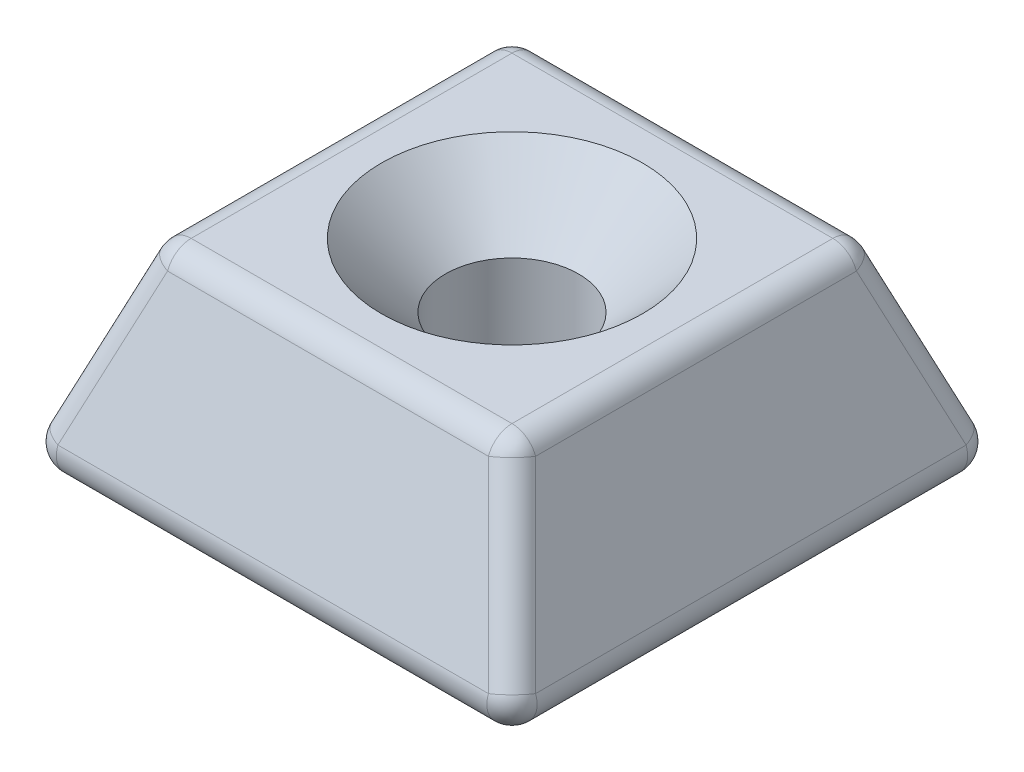
ISO-10303-21;
HEADER;
FILE_DESCRIPTION(('STEP AP214'),'2;1');
FILE_NAME('part.step','',(''),(''),'','','');
FILE_SCHEMA(('AUTOMOTIVE_DESIGN { 1 0 10303 214 1 1 1 1 }'));
ENDSEC;
DATA;
#1=APPLICATION_CONTEXT('core data for automotive mechanical design processes');
#2=APPLICATION_PROTOCOL_DEFINITION('international standard','automotive_design',2000,#1);
#3=PRODUCT_CONTEXT('',#1,'mechanical');
#4=PRODUCT('Part','Part','',(#3));
#5=PRODUCT_RELATED_PRODUCT_CATEGORY('part','',(#4));
#6=PRODUCT_DEFINITION_FORMATION('','',#4);
#7=PRODUCT_DEFINITION_CONTEXT('part definition',#1,'design');
#8=PRODUCT_DEFINITION('design','',#6,#7);
#9=PRODUCT_DEFINITION_SHAPE('','',#8);
#10=(LENGTH_UNIT() NAMED_UNIT(*) SI_UNIT(.MILLI.,.METRE.));
#11=(NAMED_UNIT(*) PLANE_ANGLE_UNIT() SI_UNIT($,.RADIAN.));
#12=(NAMED_UNIT(*) SI_UNIT($,.STERADIAN.) SOLID_ANGLE_UNIT());
#13=UNCERTAINTY_MEASURE_WITH_UNIT(LENGTH_MEASURE(1.E-05),#10,'distance_accuracy_value','');
#14=(GEOMETRIC_REPRESENTATION_CONTEXT(3) GLOBAL_UNCERTAINTY_ASSIGNED_CONTEXT((#13)) GLOBAL_UNIT_ASSIGNED_CONTEXT((#10,
#11,#12)) REPRESENTATION_CONTEXT('',''));
#15=CARTESIAN_POINT('',(0.,0.,0.));
#16=DIRECTION('',(0.,0.,1.));
#17=DIRECTION('',(1.,0.,0.));
#18=AXIS2_PLACEMENT_3D('',#15,#16,#17);
#19=CARTESIAN_POINT('',(0.,0.,0.));
#20=DIRECTION('',(-0.939692620785908,0.342020143325669,0.));
#21=DIRECTION('',(-0.342020143325669,-0.939692620785908,0.));
#22=AXIS2_PLACEMENT_3D('',#19,#20,#21);
#23=PLANE('',#22);
#24=DIRECTION('',(0.,0.,1.));
#25=VECTOR('',#24,1.);
#26=CARTESIAN_POINT('',(2.67227679155343,7.34202014332567,0.));
#27=LINE('',#26,#25);
#28=CARTESIAN_POINT('',(2.67227679155343,7.34202014332567,-3.61196941233933));
#29=VERTEX_POINT('',#28);
#30=CARTESIAN_POINT('',(2.67227679155343,7.34202014332567,-16.3880305876607));
#31=VERTEX_POINT('',#30);
#32=EDGE_CURVE('E57',#29,#31,#27,.F.);
#33=ORIENTED_EDGE('',*,*,#32,.T.);
#34=DIRECTION('',(0.323615577118185,0.889126490715988,0.323615577118185));
#35=VECTOR('',#34,1.);
#36=CARTESIAN_POINT('',(1.99612960673819,5.48432102081799,-17.0641777724759));
#37=LINE('',#36,#35);
#38=CARTESIAN_POINT('',(0.488455385956207,1.34202014332567,-18.5718519932579));
#39=VERTEX_POINT('',#38);
#40=EDGE_CURVE('E11',#31,#39,#37,.F.);
#41=ORIENTED_EDGE('',*,*,#40,.T.);
#42=DIRECTION('',(0.,0.,1.));
#43=VECTOR('',#42,1.);
#44=CARTESIAN_POINT('',(0.488455385956208,1.34202014332567,0.));
#45=LINE('',#44,#43);
#46=CARTESIAN_POINT('',(0.488455385956208,1.34202014332567,-1.42814800674212));
#47=VERTEX_POINT('',#46);
#48=EDGE_CURVE('E308',#39,#47,#45,.T.);
#49=ORIENTED_EDGE('',*,*,#48,.T.);
#50=DIRECTION('',(0.323615577118185,0.889126490715988,-0.323615577118185));
#51=VECTOR('',#50,1.);
#52=CARTESIAN_POINT('',(-0.0984112283325356,-0.270382627664434,-0.841281392453373));
#53=LINE('',#52,#51);
#54=EDGE_CURVE('E68',#47,#29,#53,.T.);
#55=ORIENTED_EDGE('',*,*,#54,.T.);
#56=EDGE_LOOP('',(#33,#41,#49,#55));
#57=FACE_BOUND('',#56,.T.);
#58=ADVANCED_FACE('F47',(#57),#23,.T.);
#59=CARTESIAN_POINT('',(0.,0.,0.));
#60=DIRECTION('',(0.,0.342020143325669,0.939692620785908));
#61=DIRECTION('',(0.,-0.939692620785908,0.342020143325669));
#62=AXIS2_PLACEMENT_3D('',#59,#60,#61);
#63=PLANE('',#62);
#64=DIRECTION('',(-0.323615577118185,0.889126490715988,-0.323615577118185));
#65=VECTOR('',#64,1.);
#66=CARTESIAN_POINT('',(17.0641777724759,5.48432102081799,-1.99612960673819));
#67=LINE('',#66,#65);
#68=CARTESIAN_POINT('',(18.5718519932579,1.34202014332567,-0.488455385956208));
#69=VERTEX_POINT('',#68);
#70=CARTESIAN_POINT('',(16.3880305876607,7.34202014332567,-2.67227679155343));
#71=VERTEX_POINT('',#70);
#72=EDGE_CURVE('E301',#69,#71,#67,.T.);
#73=ORIENTED_EDGE('',*,*,#72,.T.);
#74=DIRECTION('',(1.,0.,0.));
#75=VECTOR('',#74,1.);
#76=CARTESIAN_POINT('',(0.,7.34202014332567,-2.67227679155343));
#77=LINE('',#76,#75);
#78=CARTESIAN_POINT('',(3.61196941233933,7.34202014332567,-2.67227679155343));
#79=VERTEX_POINT('',#78);
#80=EDGE_CURVE('E304',#71,#79,#77,.F.);
#81=ORIENTED_EDGE('',*,*,#80,.T.);
#82=DIRECTION('',(0.323615577118185,0.889126490715988,-0.323615577118185));
#83=VECTOR('',#82,1.);
#84=CARTESIAN_POINT('',(0.841281392453373,-0.270382627664434,0.0984112283325356));
#85=LINE('',#84,#83);
#86=CARTESIAN_POINT('',(1.42814800674212,1.34202014332567,-0.488455385956208));
#87=VERTEX_POINT('',#86);
#88=EDGE_CURVE('E295',#79,#87,#85,.F.);
#89=ORIENTED_EDGE('',*,*,#88,.T.);
#90=DIRECTION('',(1.,0.,0.));
#91=VECTOR('',#90,1.);
#92=CARTESIAN_POINT('',(20.,1.34202014332567,-0.488455385956208));
#93=LINE('',#92,#91);
#94=EDGE_CURVE('E298',#87,#69,#93,.T.);
#95=ORIENTED_EDGE('',*,*,#94,.T.);
#96=EDGE_LOOP('',(#73,#81,#89,#95));
#97=FACE_BOUND('',#96,.T.);
#98=ADVANCED_FACE('F380',(#97),#63,.T.);
#99=CARTESIAN_POINT('',(20.,0.,0.));
#100=DIRECTION('',(0.939692620785908,0.342020143325669,0.));
#101=DIRECTION('',(-0.342020143325669,0.939692620785908,0.));
#102=AXIS2_PLACEMENT_3D('',#99,#100,#101);
#103=PLANE('',#102);
#104=DIRECTION('',(0.,0.,-1.));
#105=VECTOR('',#104,1.);
#106=CARTESIAN_POINT('',(19.5115446140438,1.34202014332567,-20.));
#107=LINE('',#106,#105);
#108=CARTESIAN_POINT('',(19.5115446140438,1.34202014332567,-1.42814800674212));
#109=VERTEX_POINT('',#108);
#110=CARTESIAN_POINT('',(19.5115446140438,1.34202014332567,-18.5718519932579));
#111=VERTEX_POINT('',#110);
#112=EDGE_CURVE('E260',#109,#111,#107,.T.);
#113=ORIENTED_EDGE('',*,*,#112,.T.);
#114=DIRECTION('',(-0.323615577118185,0.889126490715988,0.323615577118185));
#115=VECTOR('',#114,1.);
#116=CARTESIAN_POINT('',(18.0038703932618,5.48432102081799,-17.0641777724759));
#117=LINE('',#116,#115);
#118=CARTESIAN_POINT('',(17.3277232084466,7.34202014332567,-16.3880305876607));
#119=VERTEX_POINT('',#118);
#120=EDGE_CURVE('E267',#111,#119,#117,.T.);
#121=ORIENTED_EDGE('',*,*,#120,.T.);
#122=DIRECTION('',(0.,0.,-1.));
#123=VECTOR('',#122,1.);
#124=CARTESIAN_POINT('',(17.3277232084466,7.34202014332567,0.));
#125=LINE('',#124,#123);
#126=CARTESIAN_POINT('',(17.3277232084466,7.34202014332567,-3.61196941233933));
#127=VERTEX_POINT('',#126);
#128=EDGE_CURVE('E263',#119,#127,#125,.F.);
#129=ORIENTED_EDGE('',*,*,#128,.T.);
#130=DIRECTION('',(-0.323615577118185,0.889126490715988,-0.323615577118185));
#131=VECTOR('',#130,1.);
#132=CARTESIAN_POINT('',(20.0984112283325,-0.270382627664434,-0.841281392453373));
#133=LINE('',#132,#131);
#134=EDGE_CURVE('E257',#127,#109,#133,.F.);
#135=ORIENTED_EDGE('',*,*,#134,.T.);
#136=EDGE_LOOP('',(#113,#121,#129,#135));
#137=FACE_BOUND('',#136,.T.);
#138=ADVANCED_FACE('F347',(#137),#103,.T.);
#139=CARTESIAN_POINT('',(0.,0.,-20.));
#140=DIRECTION('',(0.,0.342020143325669,-0.939692620785908));
#141=DIRECTION('',(0.,0.939692620785908,0.342020143325669));
#142=AXIS2_PLACEMENT_3D('',#139,#140,#141);
#143=PLANE('',#142);
#144=DIRECTION('',(-1.,0.,0.));
#145=VECTOR('',#144,1.);
#146=CARTESIAN_POINT('',(0.,7.34202014332567,-17.3277232084466));
#147=LINE('',#146,#145);
#148=CARTESIAN_POINT('',(3.61196941233934,7.34202014332567,-17.3277232084466));
#149=VERTEX_POINT('',#148);
#150=CARTESIAN_POINT('',(16.3880305876607,7.34202014332567,-17.3277232084466));
#151=VERTEX_POINT('',#150);
#152=EDGE_CURVE('E172',#149,#151,#147,.F.);
#153=ORIENTED_EDGE('',*,*,#152,.T.);
#154=DIRECTION('',(-0.323615577118185,0.889126490715988,0.323615577118185));
#155=VECTOR('',#154,1.);
#156=CARTESIAN_POINT('',(17.0641777724759,5.48432102081799,-18.0038703932618));
#157=LINE('',#156,#155);
#158=CARTESIAN_POINT('',(18.5718519932579,1.34202014332567,-19.5115446140438));
#159=VERTEX_POINT('',#158);
#160=EDGE_CURVE('E291',#151,#159,#157,.F.);
#161=ORIENTED_EDGE('',*,*,#160,.T.);
#162=DIRECTION('',(-1.,0.,0.));
#163=VECTOR('',#162,1.);
#164=CARTESIAN_POINT('',(0.,1.34202014332567,-19.5115446140438));
#165=LINE('',#164,#163);
#166=CARTESIAN_POINT('',(1.42814800674212,1.34202014332567,-19.5115446140438));
#167=VERTEX_POINT('',#166);
#168=EDGE_CURVE('E286',#159,#167,#165,.T.);
#169=ORIENTED_EDGE('',*,*,#168,.T.);
#170=DIRECTION('',(0.323615577118185,0.889126490715988,0.323615577118185));
#171=VECTOR('',#170,1.);
#172=CARTESIAN_POINT('',(0.841281392453373,-0.270382627664434,-20.0984112283325));
#173=LINE('',#172,#171);
#174=EDGE_CURVE('E283',#167,#149,#173,.T.);
#175=ORIENTED_EDGE('',*,*,#174,.T.);
#176=EDGE_LOOP('',(#153,#161,#169,#175));
#177=FACE_BOUND('',#176,.T.);
#178=ADVANCED_FACE('F360',(#177),#143,.T.);
#179=CARTESIAN_POINT('',(0.,8.,0.));
#180=DIRECTION('',(0.,-1.,0.));
#181=DIRECTION('',(0.,0.,-1.));
#182=AXIS2_PLACEMENT_3D('',#179,#180,#181);
#183=PLANE('',#182);
#184=DIRECTION('',(-1.,0.,0.));
#185=VECTOR('',#184,1.);
#186=CARTESIAN_POINT('',(0.,8.,-3.61196941233933));
#187=LINE('',#186,#185);
#188=CARTESIAN_POINT('',(3.61196941233933,8.,-3.61196941233933));
#189=VERTEX_POINT('',#188);
#190=CARTESIAN_POINT('',(16.3880305876607,8.,-3.61196941233933));
#191=VERTEX_POINT('',#190);
#192=EDGE_CURVE('E148',#189,#191,#187,.F.);
#193=ORIENTED_EDGE('',*,*,#192,.T.);
#194=DIRECTION('',(0.,0.,1.));
#195=VECTOR('',#194,1.);
#196=CARTESIAN_POINT('',(16.3880305876607,8.,0.));
#197=LINE('',#196,#195);
#198=CARTESIAN_POINT('',(16.3880305876607,8.,-16.3880305876607));
#199=VERTEX_POINT('',#198);
#200=EDGE_CURVE('E143',#191,#199,#197,.F.);
#201=ORIENTED_EDGE('',*,*,#200,.T.);
#202=DIRECTION('',(1.,0.,0.));
#203=VECTOR('',#202,1.);
#204=CARTESIAN_POINT('',(0.,8.,-16.3880305876607));
#205=LINE('',#204,#203);
#206=CARTESIAN_POINT('',(3.61196941233933,8.,-16.3880305876607));
#207=VERTEX_POINT('',#206);
#208=EDGE_CURVE('E136',#199,#207,#205,.F.);
#209=ORIENTED_EDGE('',*,*,#208,.T.);
#210=DIRECTION('',(0.,0.,-1.));
#211=VECTOR('',#210,1.);
#212=CARTESIAN_POINT('',(3.61196941233933,8.,0.));
#213=LINE('',#212,#211);
#214=EDGE_CURVE('E140',#207,#189,#213,.F.);
#215=ORIENTED_EDGE('',*,*,#214,.T.);
#216=EDGE_LOOP('',(#193,#201,#209,#215));
#217=FACE_BOUND('',#216,.T.);
#218=CARTESIAN_POINT('',(10.,8.,-10.));
#219=DIRECTION('',(0.,1.,0.));
#220=DIRECTION('',(0.,0.,1.));
#221=AXIS2_PLACEMENT_3D('',#218,#219,#220);
#222=CIRCLE('',#221,5.2);
#223=CARTESIAN_POINT('',(10.,8.,-4.8));
#224=VERTEX_POINT('',#223);
#225=EDGE_CURVE('E235',#224,#224,#222,.T.);
#226=ORIENTED_EDGE('',*,*,#225,.F.);
#227=EDGE_LOOP('',(#226));
#228=FACE_BOUND('',#227,.T.);
#229=ADVANCED_FACE('F138',(#217,#228),#183,.F.);
#230=CARTESIAN_POINT('',(0.,0.,0.));
#231=DIRECTION('',(0.,-1.,0.));
#232=DIRECTION('',(0.,0.,-1.));
#233=AXIS2_PLACEMENT_3D('',#230,#231,#232);
#234=PLANE('',#233);
#235=DIRECTION('',(1.,0.,0.));
#236=VECTOR('',#235,1.);
#237=CARTESIAN_POINT('',(20.,0.,-18.5718519932579));
#238=LINE('',#237,#236);
#239=CARTESIAN_POINT('',(1.42814800674212,0.,-18.5718519932579));
#240=VERTEX_POINT('',#239);
#241=CARTESIAN_POINT('',(18.5718519932579,0.,-18.5718519932579));
#242=VERTEX_POINT('',#241);
#243=EDGE_CURVE('E276',#240,#242,#238,.T.);
#244=ORIENTED_EDGE('',*,*,#243,.T.);
#245=DIRECTION('',(0.,0.,1.));
#246=VECTOR('',#245,1.);
#247=CARTESIAN_POINT('',(18.5718519932579,0.,0.));
#248=LINE('',#247,#246);
#249=CARTESIAN_POINT('',(18.5718519932579,0.,-1.42814800674212));
#250=VERTEX_POINT('',#249);
#251=EDGE_CURVE('E279',#242,#250,#248,.T.);
#252=ORIENTED_EDGE('',*,*,#251,.T.);
#253=DIRECTION('',(-1.,0.,0.));
#254=VECTOR('',#253,1.);
#255=CARTESIAN_POINT('',(0.,0.,-1.42814800674212));
#256=LINE('',#255,#254);
#257=CARTESIAN_POINT('',(1.42814800674212,0.,-1.42814800674212));
#258=VERTEX_POINT('',#257);
#259=EDGE_CURVE('E273',#250,#258,#256,.T.);
#260=ORIENTED_EDGE('',*,*,#259,.T.);
#261=DIRECTION('',(0.,0.,-1.));
#262=VECTOR('',#261,1.);
#263=CARTESIAN_POINT('',(1.42814800674212,0.,-20.));
#264=LINE('',#263,#262);
#265=EDGE_CURVE('E270',#258,#240,#264,.T.);
#266=ORIENTED_EDGE('',*,*,#265,.T.);
#267=EDGE_LOOP('',(#244,#252,#260,#266));
#268=FACE_BOUND('',#267,.T.);
#269=CARTESIAN_POINT('',(10.,0.,-10.));
#270=DIRECTION('',(0.,1.,0.));
#271=DIRECTION('',(0.,0.,1.));
#272=AXIS2_PLACEMENT_3D('',#269,#270,#271);
#273=CIRCLE('',#272,2.65);
#274=CARTESIAN_POINT('',(10.,0.,-7.35));
#275=VERTEX_POINT('',#274);
#276=EDGE_CURVE('E160',#275,#275,#273,.T.);
#277=ORIENTED_EDGE('',*,*,#276,.T.);
#278=EDGE_LOOP('',(#277));
#279=FACE_BOUND('',#278,.T.);
#280=ADVANCED_FACE('F415',(#268,#279),#234,.T.);
#281=CARTESIAN_POINT('',(10.,8.,-10.));
#282=DIRECTION('',(0.,1.,0.));
#283=DIRECTION('',(0.,0.,1.));
#284=AXIS2_PLACEMENT_3D('',#281,#282,#283);
#285=CYLINDRICAL_SURFACE('',#284,2.65);
#286=ORIENTED_EDGE('',*,*,#276,.F.);
#287=EDGE_LOOP('',(#286));
#288=FACE_BOUND('',#287,.T.);
#289=CARTESIAN_POINT('',(10.,5.45,-10.));
#290=DIRECTION('',(0.,1.,0.));
#291=DIRECTION('',(0.,0.,1.));
#292=AXIS2_PLACEMENT_3D('',#289,#290,#291);
#293=CIRCLE('',#292,2.65);
#294=CARTESIAN_POINT('',(10.,5.45,-7.35));
#295=VERTEX_POINT('',#294);
#296=EDGE_CURVE('E242',#295,#295,#293,.T.);
#297=ORIENTED_EDGE('',*,*,#296,.T.);
#298=EDGE_LOOP('',(#297));
#299=FACE_BOUND('',#298,.T.);
#300=ADVANCED_FACE('F574',(#288,#299),#285,.F.);
#301=CARTESIAN_POINT('',(10.,8.,-10.));
#302=DIRECTION('',(0.,1.,0.));
#303=DIRECTION('',(0.,0.,1.));
#304=AXIS2_PLACEMENT_3D('',#301,#302,#303);
#305=CONICAL_SURFACE('',#304,5.2,0.785398163397449);
#306=ORIENTED_EDGE('',*,*,#296,.F.);
#307=EDGE_LOOP('',(#306));
#308=FACE_BOUND('',#307,.T.);
#309=ORIENTED_EDGE('',*,*,#225,.T.);
#310=EDGE_LOOP('',(#309));
#311=FACE_BOUND('',#310,.T.);
#312=ADVANCED_FACE('F568',(#308,#311),#305,.F.);
#313=CARTESIAN_POINT('',(1.42814800674212,1.,0.));
#314=DIRECTION('',(0.,0.,1.));
#315=DIRECTION('',(1.,0.,0.));
#316=AXIS2_PLACEMENT_3D('',#313,#314,#315);
#317=CYLINDRICAL_SURFACE('',#316,1.);
#318=CARTESIAN_POINT('',(1.42814800674212,1.,-1.42814800674212));
#319=DIRECTION('',(0.,0.,1.));
#320=DIRECTION('',(0.,-1.,0.));
#321=AXIS2_PLACEMENT_3D('',#318,#319,#320);
#322=CIRCLE('',#321,1.);
#323=EDGE_CURVE('E51',#47,#258,#322,.T.);
#324=ORIENTED_EDGE('',*,*,#323,.F.);
#325=ORIENTED_EDGE('',*,*,#48,.F.);
#326=CARTESIAN_POINT('',(1.42814800674212,1.,-18.5718519932579));
#327=DIRECTION('',(0.,0.,-1.));
#328=DIRECTION('',(-1.,0.,0.));
#329=AXIS2_PLACEMENT_3D('',#326,#327,#328);
#330=CIRCLE('',#329,1.);
#331=EDGE_CURVE('E225',#240,#39,#330,.T.);
#332=ORIENTED_EDGE('',*,*,#331,.F.);
#333=ORIENTED_EDGE('',*,*,#265,.F.);
#334=EDGE_LOOP('',(#324,#325,#332,#333));
#335=FACE_BOUND('',#334,.T.);
#336=ADVANCED_FACE('F49',(#335),#317,.T.);
#337=CARTESIAN_POINT('',(1.42814800674212,1.,-1.42814800674212));
#338=DIRECTION('',(0.,-1.,0.));
#339=DIRECTION('',(0.,0.,-1.));
#340=AXIS2_PLACEMENT_3D('',#337,#338,#339);
#341=SPHERICAL_SURFACE('',#340,1.);
#342=CARTESIAN_POINT('',(1.42814800674212,1.,-1.42814800674212));
#343=DIRECTION('',(-0.323615577118185,-0.889126490715988,0.323615577118185));
#344=DIRECTION('',(0.939692620785908,-0.34202014332567,0.));
#345=AXIS2_PLACEMENT_3D('',#342,#343,#344);
#346=CIRCLE('',#345,1.);
#347=EDGE_CURVE('E218',#47,#87,#346,.F.);
#348=ORIENTED_EDGE('',*,*,#347,.F.);
#349=ORIENTED_EDGE('',*,*,#323,.T.);
#350=CARTESIAN_POINT('',(1.42814800674212,1.,-1.42814800674212));
#351=DIRECTION('',(-1.,0.,0.));
#352=DIRECTION('',(0.,0.,1.));
#353=AXIS2_PLACEMENT_3D('',#350,#351,#352);
#354=CIRCLE('',#353,1.);
#355=EDGE_CURVE('E222',#87,#258,#354,.F.);
#356=ORIENTED_EDGE('',*,*,#355,.F.);
#357=EDGE_LOOP('',(#348,#349,#356));
#358=FACE_BOUND('',#357,.T.);
#359=ADVANCED_FACE('F367',(#358),#341,.T.);
#360=CARTESIAN_POINT('',(1.42814800674212,1.,-18.5718519932579));
#361=DIRECTION('',(0.,-1.,0.));
#362=DIRECTION('',(0.,0.,-1.));
#363=AXIS2_PLACEMENT_3D('',#360,#361,#362);
#364=SPHERICAL_SURFACE('',#363,1.);
#365=CARTESIAN_POINT('',(1.42814800674212,0.999999999999999,-18.5718519932579));
#366=DIRECTION('',(-1.,0.,0.));
#367=DIRECTION('',(0.,-1.,0.));
#368=AXIS2_PLACEMENT_3D('',#365,#366,#367);
#369=CIRCLE('',#368,1.);
#370=EDGE_CURVE('E211',#240,#167,#369,.F.);
#371=ORIENTED_EDGE('',*,*,#370,.F.);
#372=ORIENTED_EDGE('',*,*,#331,.T.);
#373=CARTESIAN_POINT('',(1.42814800674212,1.,-18.5718519932579));
#374=DIRECTION('',(-0.323615577118185,-0.889126490715988,-0.323615577118185));
#375=DIRECTION('',(0.939692620785908,-0.342020143325669,0.));
#376=AXIS2_PLACEMENT_3D('',#373,#374,#375);
#377=CIRCLE('',#376,1.);
#378=EDGE_CURVE('E215',#167,#39,#377,.F.);
#379=ORIENTED_EDGE('',*,*,#378,.F.);
#380=EDGE_LOOP('',(#371,#372,#379));
#381=FACE_BOUND('',#380,.T.);
#382=ADVANCED_FACE('F398',(#381),#364,.T.);
#383=CARTESIAN_POINT('',(0.,1.,-1.42814800674212));
#384=DIRECTION('',(1.,0.,0.));
#385=DIRECTION('',(0.,0.,-1.));
#386=AXIS2_PLACEMENT_3D('',#383,#384,#385);
#387=CYLINDRICAL_SURFACE('',#386,1.);
#388=ORIENTED_EDGE('',*,*,#355,.T.);
#389=ORIENTED_EDGE('',*,*,#259,.F.);
#390=CARTESIAN_POINT('',(18.5718519932579,1.,-1.42814800674212));
#391=DIRECTION('',(1.,0.,0.));
#392=DIRECTION('',(0.,0.,-1.));
#393=AXIS2_PLACEMENT_3D('',#390,#391,#392);
#394=CIRCLE('',#393,1.);
#395=EDGE_CURVE('E204',#69,#250,#394,.T.);
#396=ORIENTED_EDGE('',*,*,#395,.F.);
#397=ORIENTED_EDGE('',*,*,#94,.F.);
#398=EDGE_LOOP('',(#388,#389,#396,#397));
#399=FACE_BOUND('',#398,.T.);
#400=ADVANCED_FACE('F384',(#399),#387,.T.);
#401=CARTESIAN_POINT('',(0.841281392453373,-0.612402770990103,-0.841281392453373));
#402=DIRECTION('',(-0.323615577118185,-0.889126490715988,0.323615577118185));
#403=DIRECTION('',(0.,-0.342020143325669,-0.939692620785908));
#404=AXIS2_PLACEMENT_3D('',#401,#402,#403);
#405=CYLINDRICAL_SURFACE('',#404,1.);
#406=ORIENTED_EDGE('',*,*,#347,.T.);
#407=ORIENTED_EDGE('',*,*,#88,.F.);
#408=CARTESIAN_POINT('',(3.61196941233933,7.,-3.61196941233933));
#409=DIRECTION('',(0.323615577118185,0.889126490715988,-0.323615577118185));
#410=DIRECTION('',(-0.939692620785908,0.342020143325669,0.));
#411=AXIS2_PLACEMENT_3D('',#408,#409,#410);
#412=CIRCLE('',#411,1.);
#413=EDGE_CURVE('E200',#29,#79,#412,.T.);
#414=ORIENTED_EDGE('',*,*,#413,.F.);
#415=ORIENTED_EDGE('',*,*,#54,.F.);
#416=EDGE_LOOP('',(#406,#407,#414,#415));
#417=FACE_BOUND('',#416,.T.);
#418=ADVANCED_FACE('F372',(#417),#405,.T.);
#419=CARTESIAN_POINT('',(3.61196941233933,7.,0.));
#420=DIRECTION('',(0.,0.,-1.));
#421=DIRECTION('',(-1.,0.,0.));
#422=AXIS2_PLACEMENT_3D('',#419,#420,#421);
#423=CYLINDRICAL_SURFACE('',#422,1.);
#424=CARTESIAN_POINT('',(3.61196941233933,7.,-16.3880305876607));
#425=DIRECTION('',(0.,0.,-1.));
#426=DIRECTION('',(-1.,0.,0.));
#427=AXIS2_PLACEMENT_3D('',#424,#425,#426);
#428=CIRCLE('',#427,1.);
#429=EDGE_CURVE('E154',#31,#207,#428,.T.);
#430=ORIENTED_EDGE('',*,*,#429,.F.);
#431=ORIENTED_EDGE('',*,*,#32,.F.);
#432=CARTESIAN_POINT('',(3.61196941233933,7.,-3.61196941233933));
#433=DIRECTION('',(0.,0.,1.));
#434=DIRECTION('',(1.,0.,0.));
#435=AXIS2_PLACEMENT_3D('',#432,#433,#434);
#436=CIRCLE('',#435,1.);
#437=EDGE_CURVE('E157',#189,#29,#436,.T.);
#438=ORIENTED_EDGE('',*,*,#437,.F.);
#439=ORIENTED_EDGE('',*,*,#214,.F.);
#440=EDGE_LOOP('',(#430,#431,#438,#439));
#441=FACE_BOUND('',#440,.T.);
#442=ADVANCED_FACE('F153',(#441),#423,.T.);
#443=CARTESIAN_POINT('',(2.9358222275241,5.14230087749232,-17.0641777724759));
#444=DIRECTION('',(-0.323615577118185,-0.889126490715988,-0.323615577118185));
#445=DIRECTION('',(0.,0.342020143325669,-0.939692620785908));
#446=AXIS2_PLACEMENT_3D('',#443,#444,#445);
#447=CYLINDRICAL_SURFACE('',#446,1.);
#448=ORIENTED_EDGE('',*,*,#378,.T.);
#449=ORIENTED_EDGE('',*,*,#40,.F.);
#450=CARTESIAN_POINT('',(3.61196941233934,7.,-16.3880305876607));
#451=DIRECTION('',(0.323615577118184,0.889126490715988,0.323615577118185));
#452=DIRECTION('',(0.,-0.342020143325669,0.939692620785908));
#453=AXIS2_PLACEMENT_3D('',#450,#451,#452);
#454=CIRCLE('',#453,1.);
#455=EDGE_CURVE('E168',#149,#31,#454,.T.);
#456=ORIENTED_EDGE('',*,*,#455,.F.);
#457=ORIENTED_EDGE('',*,*,#174,.F.);
#458=EDGE_LOOP('',(#448,#449,#456,#457));
#459=FACE_BOUND('',#458,.T.);
#460=ADVANCED_FACE('F364',(#459),#447,.T.);
#461=CARTESIAN_POINT('',(0.,1.,-18.5718519932579));
#462=DIRECTION('',(-1.,0.,0.));
#463=DIRECTION('',(0.,0.,1.));
#464=AXIS2_PLACEMENT_3D('',#461,#462,#463);
#465=CYLINDRICAL_SURFACE('',#464,1.);
#466=ORIENTED_EDGE('',*,*,#370,.T.);
#467=ORIENTED_EDGE('',*,*,#168,.F.);
#468=CARTESIAN_POINT('',(18.5718519932579,1.,-18.5718519932579));
#469=DIRECTION('',(1.,0.,0.));
#470=DIRECTION('',(0.,0.,-1.));
#471=AXIS2_PLACEMENT_3D('',#468,#469,#470);
#472=CIRCLE('',#471,1.);
#473=EDGE_CURVE('E192',#242,#159,#472,.T.);
#474=ORIENTED_EDGE('',*,*,#473,.F.);
#475=ORIENTED_EDGE('',*,*,#243,.F.);
#476=EDGE_LOOP('',(#466,#467,#474,#475));
#477=FACE_BOUND('',#476,.T.);
#478=ADVANCED_FACE('F397',(#477),#465,.T.);
#479=CARTESIAN_POINT('',(18.5718519932579,1.,0.));
#480=DIRECTION('',(0.,0.,-1.));
#481=DIRECTION('',(-1.,0.,0.));
#482=AXIS2_PLACEMENT_3D('',#479,#480,#481);
#483=CYLINDRICAL_SURFACE('',#482,1.);
#484=CARTESIAN_POINT('',(18.5718519932579,1.,-1.42814800674212));
#485=DIRECTION('',(0.,0.,1.));
#486=DIRECTION('',(1.,0.,0.));
#487=AXIS2_PLACEMENT_3D('',#484,#485,#486);
#488=CIRCLE('',#487,1.);
#489=EDGE_CURVE('E207',#250,#109,#488,.T.);
#490=ORIENTED_EDGE('',*,*,#489,.F.);
#491=ORIENTED_EDGE('',*,*,#251,.F.);
#492=CARTESIAN_POINT('',(18.5718519932579,0.999999999999999,-18.5718519932579));
#493=DIRECTION('',(0.,0.,-1.));
#494=DIRECTION('',(-1.,0.,0.));
#495=AXIS2_PLACEMENT_3D('',#492,#493,#494);
#496=CIRCLE('',#495,1.);
#497=EDGE_CURVE('E188',#111,#242,#496,.T.);
#498=ORIENTED_EDGE('',*,*,#497,.F.);
#499=ORIENTED_EDGE('',*,*,#112,.F.);
#500=EDGE_LOOP('',(#490,#491,#498,#499));
#501=FACE_BOUND('',#500,.T.);
#502=ADVANCED_FACE('F390',(#501),#483,.T.);
#503=CARTESIAN_POINT('',(18.5718519932579,1.,-1.42814800674212));
#504=DIRECTION('',(0.,-1.,0.));
#505=DIRECTION('',(0.,0.,-1.));
#506=AXIS2_PLACEMENT_3D('',#503,#504,#505);
#507=SPHERICAL_SURFACE('',#506,1.);
#508=ORIENTED_EDGE('',*,*,#395,.T.);
#509=ORIENTED_EDGE('',*,*,#489,.T.);
#510=CARTESIAN_POINT('',(18.5718519932579,0.999999999999999,-1.42814800674212));
#511=DIRECTION('',(0.323615577118185,-0.889126490715988,0.323615577118186));
#512=DIRECTION('',(0.,-0.34202014332567,-0.939692620785908));
#513=AXIS2_PLACEMENT_3D('',#510,#511,#512);
#514=CIRCLE('',#513,1.);
#515=EDGE_CURVE('E179',#69,#109,#514,.F.);
#516=ORIENTED_EDGE('',*,*,#515,.F.);
#517=EDGE_LOOP('',(#508,#509,#516));
#518=FACE_BOUND('',#517,.T.);
#519=ADVANCED_FACE('F387',(#518),#507,.T.);
#520=CARTESIAN_POINT('',(3.61196941233933,7.,-3.61196941233933));
#521=DIRECTION('',(0.,1.,0.));
#522=DIRECTION('',(0.,0.,1.));
#523=AXIS2_PLACEMENT_3D('',#520,#521,#522);
#524=SPHERICAL_SURFACE('',#523,1.);
#525=ORIENTED_EDGE('',*,*,#437,.T.);
#526=ORIENTED_EDGE('',*,*,#413,.T.);
#527=CARTESIAN_POINT('',(3.61196941233933,7.,-3.61196941233933));
#528=DIRECTION('',(-1.,0.,0.));
#529=DIRECTION('',(0.,0.,1.));
#530=AXIS2_PLACEMENT_3D('',#527,#528,#529);
#531=CIRCLE('',#530,1.);
#532=EDGE_CURVE('E174',#189,#79,#531,.F.);
#533=ORIENTED_EDGE('',*,*,#532,.F.);
#534=EDGE_LOOP('',(#525,#526,#533));
#535=FACE_BOUND('',#534,.T.);
#536=ADVANCED_FACE('F374',(#535),#524,.T.);
#537=CARTESIAN_POINT('',(3.61196941233933,7.,-16.3880305876607));
#538=DIRECTION('',(0.,1.,0.));
#539=DIRECTION('',(0.,0.,1.));
#540=AXIS2_PLACEMENT_3D('',#537,#538,#539);
#541=SPHERICAL_SURFACE('',#540,1.);
#542=ORIENTED_EDGE('',*,*,#455,.T.);
#543=ORIENTED_EDGE('',*,*,#429,.T.);
#544=CARTESIAN_POINT('',(3.61196941233933,7.,-16.3880305876607));
#545=DIRECTION('',(-1.,0.,0.));
#546=DIRECTION('',(0.,0.,1.));
#547=AXIS2_PLACEMENT_3D('',#544,#545,#546);
#548=CIRCLE('',#547,1.);
#549=EDGE_CURVE('E165',#149,#207,#548,.F.);
#550=ORIENTED_EDGE('',*,*,#549,.F.);
#551=EDGE_LOOP('',(#542,#543,#550));
#552=FACE_BOUND('',#551,.T.);
#553=ADVANCED_FACE('F164',(#552),#541,.T.);
#554=CARTESIAN_POINT('',(18.5718519932579,0.999999999999999,-18.5718519932579));
#555=DIRECTION('',(0.,-1.,0.));
#556=DIRECTION('',(0.,0.,-1.));
#557=AXIS2_PLACEMENT_3D('',#554,#555,#556);
#558=SPHERICAL_SURFACE('',#557,1.);
#559=ORIENTED_EDGE('',*,*,#497,.T.);
#560=ORIENTED_EDGE('',*,*,#473,.T.);
#561=CARTESIAN_POINT('',(18.5718519932579,0.999999999999999,-18.5718519932579));
#562=DIRECTION('',(0.323615577118185,-0.889126490715988,-0.323615577118185));
#563=DIRECTION('',(0.,0.34202014332567,-0.939692620785908));
#564=AXIS2_PLACEMENT_3D('',#561,#562,#563);
#565=CIRCLE('',#564,1.);
#566=EDGE_CURVE('E175',#111,#159,#565,.F.);
#567=ORIENTED_EDGE('',*,*,#566,.F.);
#568=EDGE_LOOP('',(#559,#560,#567));
#569=FACE_BOUND('',#568,.T.);
#570=ADVANCED_FACE('F394',(#569),#558,.T.);
#571=CARTESIAN_POINT('',(19.1587186075466,-0.612402770990103,-0.841281392453373));
#572=DIRECTION('',(0.323615577118185,-0.889126490715988,0.323615577118185));
#573=DIRECTION('',(0.,-0.342020143325669,-0.939692620785908));
#574=AXIS2_PLACEMENT_3D('',#571,#572,#573);
#575=CYLINDRICAL_SURFACE('',#574,1.);
#576=ORIENTED_EDGE('',*,*,#515,.T.);
#577=ORIENTED_EDGE('',*,*,#134,.F.);
#578=CARTESIAN_POINT('',(16.3880305876607,7.,-3.61196941233933));
#579=DIRECTION('',(-0.323615577118186,0.889126490715988,-0.323615577118185));
#580=DIRECTION('',(-0.939692620785908,-0.34202014332567,0.));
#581=AXIS2_PLACEMENT_3D('',#578,#579,#580);
#582=CIRCLE('',#581,1.);
#583=EDGE_CURVE('E181',#71,#127,#582,.T.);
#584=ORIENTED_EDGE('',*,*,#583,.F.);
#585=ORIENTED_EDGE('',*,*,#72,.F.);
#586=EDGE_LOOP('',(#576,#577,#584,#585));
#587=FACE_BOUND('',#586,.T.);
#588=ADVANCED_FACE('F342',(#587),#575,.T.);
#589=CARTESIAN_POINT('',(0.,7.,-3.61196941233933));
#590=DIRECTION('',(-1.,0.,0.));
#591=DIRECTION('',(0.,0.,1.));
#592=AXIS2_PLACEMENT_3D('',#589,#590,#591);
#593=CYLINDRICAL_SURFACE('',#592,1.);
#594=ORIENTED_EDGE('',*,*,#532,.T.);
#595=ORIENTED_EDGE('',*,*,#80,.F.);
#596=CARTESIAN_POINT('',(16.3880305876607,7.,-3.61196941233933));
#597=DIRECTION('',(1.,0.,0.));
#598=DIRECTION('',(0.,0.,-1.));
#599=AXIS2_PLACEMENT_3D('',#596,#597,#598);
#600=CIRCLE('',#599,1.);
#601=EDGE_CURVE('E329',#191,#71,#600,.T.);
#602=ORIENTED_EDGE('',*,*,#601,.F.);
#603=ORIENTED_EDGE('',*,*,#192,.F.);
#604=EDGE_LOOP('',(#594,#595,#602,#603));
#605=FACE_BOUND('',#604,.T.);
#606=ADVANCED_FACE('F378',(#605),#593,.T.);
#607=CARTESIAN_POINT('',(0.,7.,-16.3880305876607));
#608=DIRECTION('',(1.,0.,0.));
#609=DIRECTION('',(0.,0.,-1.));
#610=AXIS2_PLACEMENT_3D('',#607,#608,#609);
#611=CYLINDRICAL_SURFACE('',#610,1.);
#612=ORIENTED_EDGE('',*,*,#549,.T.);
#613=ORIENTED_EDGE('',*,*,#208,.F.);
#614=CARTESIAN_POINT('',(16.3880305876607,7.,-16.3880305876607));
#615=DIRECTION('',(1.,0.,0.));
#616=DIRECTION('',(0.,0.,-1.));
#617=AXIS2_PLACEMENT_3D('',#614,#615,#616);
#618=CIRCLE('',#617,1.);
#619=EDGE_CURVE('E325',#151,#199,#618,.T.);
#620=ORIENTED_EDGE('',*,*,#619,.F.);
#621=ORIENTED_EDGE('',*,*,#152,.F.);
#622=EDGE_LOOP('',(#612,#613,#620,#621));
#623=FACE_BOUND('',#622,.T.);
#624=ADVANCED_FACE('F171',(#623),#611,.T.);
#625=CARTESIAN_POINT('',(17.0641777724759,5.14230087749232,-17.0641777724759));
#626=DIRECTION('',(0.323615577118185,-0.889126490715988,-0.323615577118185));
#627=DIRECTION('',(0.,0.342020143325669,-0.939692620785908));
#628=AXIS2_PLACEMENT_3D('',#625,#626,#627);
#629=CYLINDRICAL_SURFACE('',#628,1.);
#630=ORIENTED_EDGE('',*,*,#566,.T.);
#631=ORIENTED_EDGE('',*,*,#160,.F.);
#632=CARTESIAN_POINT('',(16.3880305876607,7.,-16.3880305876607));
#633=DIRECTION('',(-0.323615577118185,0.889126490715988,0.323615577118185));
#634=DIRECTION('',(0.,-0.342020143325669,0.939692620785908));
#635=AXIS2_PLACEMENT_3D('',#632,#633,#634);
#636=CIRCLE('',#635,1.);
#637=EDGE_CURVE('E321',#119,#151,#636,.T.);
#638=ORIENTED_EDGE('',*,*,#637,.F.);
#639=ORIENTED_EDGE('',*,*,#120,.F.);
#640=EDGE_LOOP('',(#630,#631,#638,#639));
#641=FACE_BOUND('',#640,.T.);
#642=ADVANCED_FACE('F357',(#641),#629,.T.);
#643=CARTESIAN_POINT('',(16.3880305876607,7.,-3.61196941233933));
#644=DIRECTION('',(0.,1.,0.));
#645=DIRECTION('',(-1.,0.,0.));
#646=AXIS2_PLACEMENT_3D('',#643,#644,#645);
#647=SPHERICAL_SURFACE('',#646,1.);
#648=ORIENTED_EDGE('',*,*,#601,.T.);
#649=ORIENTED_EDGE('',*,*,#583,.T.);
#650=CARTESIAN_POINT('',(16.3880305876607,7.,-3.61196941233933));
#651=DIRECTION('',(0.,0.,1.));
#652=DIRECTION('',(1.,0.,0.));
#653=AXIS2_PLACEMENT_3D('',#650,#651,#652);
#654=CIRCLE('',#653,1.);
#655=EDGE_CURVE('E318',#191,#127,#654,.F.);
#656=ORIENTED_EDGE('',*,*,#655,.F.);
#657=EDGE_LOOP('',(#648,#649,#656));
#658=FACE_BOUND('',#657,.T.);
#659=ADVANCED_FACE('F338',(#658),#647,.T.);
#660=CARTESIAN_POINT('',(16.3880305876607,7.,-16.3880305876607));
#661=DIRECTION('',(0.,1.,0.));
#662=DIRECTION('',(0.,0.,1.));
#663=AXIS2_PLACEMENT_3D('',#660,#661,#662);
#664=SPHERICAL_SURFACE('',#663,1.);
#665=ORIENTED_EDGE('',*,*,#637,.T.);
#666=ORIENTED_EDGE('',*,*,#619,.T.);
#667=CARTESIAN_POINT('',(16.3880305876607,7.,-16.3880305876607));
#668=DIRECTION('',(0.,0.,-1.));
#669=DIRECTION('',(-1.,0.,0.));
#670=AXIS2_PLACEMENT_3D('',#667,#668,#669);
#671=CIRCLE('',#670,1.);
#672=EDGE_CURVE('E315',#119,#199,#671,.F.);
#673=ORIENTED_EDGE('',*,*,#672,.F.);
#674=EDGE_LOOP('',(#665,#666,#673));
#675=FACE_BOUND('',#674,.T.);
#676=ADVANCED_FACE('F354',(#675),#664,.T.);
#677=CARTESIAN_POINT('',(16.3880305876607,7.,0.));
#678=DIRECTION('',(0.,0.,1.));
#679=DIRECTION('',(1.,0.,0.));
#680=AXIS2_PLACEMENT_3D('',#677,#678,#679);
#681=CYLINDRICAL_SURFACE('',#680,1.);
#682=ORIENTED_EDGE('',*,*,#655,.T.);
#683=ORIENTED_EDGE('',*,*,#128,.F.);
#684=ORIENTED_EDGE('',*,*,#672,.T.);
#685=ORIENTED_EDGE('',*,*,#200,.F.);
#686=EDGE_LOOP('',(#682,#683,#684,#685));
#687=FACE_BOUND('',#686,.T.);
#688=ADVANCED_FACE('F352',(#687),#681,.T.);
#689=CLOSED_SHELL('',(#58,#98,#138,#178,#229,#280,#300,#312,#336,#359,#382,#400,#418,#442,#460,
#478,#502,#519,#536,#553,#570,#588,#606,#624,#642,#659,#676,#688));
#690=MANIFOLD_SOLID_BREP('B2',#689);
#691=ADVANCED_BREP_SHAPE_REPRESENTATION('',(#18,#690),#14);
#692=SHAPE_DEFINITION_REPRESENTATION(#9,#691);
ENDSEC;
END-ISO-10303-21;
